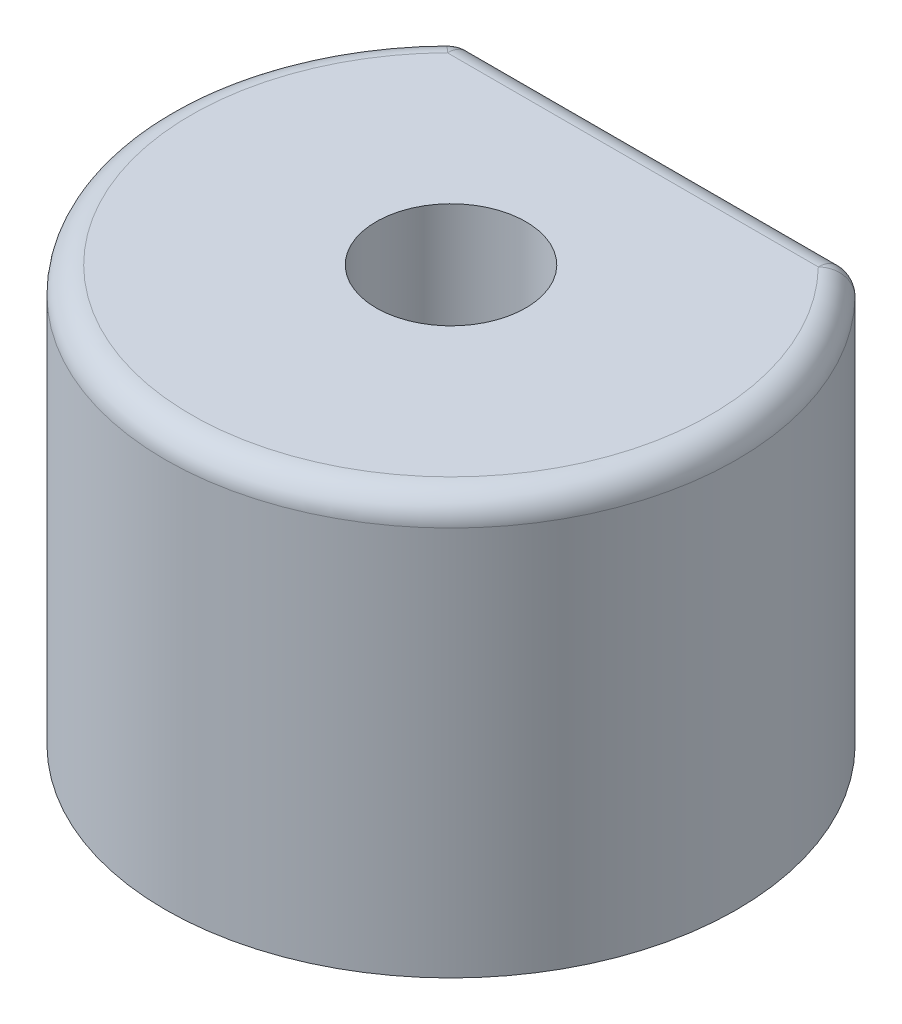
ISO-10303-21;
HEADER;
FILE_DESCRIPTION(('STEP AP214'),'2;1');
FILE_NAME('part.step','',(''),(''),'','','');
FILE_SCHEMA(('AUTOMOTIVE_DESIGN { 1 0 10303 214 1 1 1 1 }'));
ENDSEC;
DATA;
#1=APPLICATION_CONTEXT('core data for automotive mechanical design processes');
#2=APPLICATION_PROTOCOL_DEFINITION('international standard','automotive_design',2000,#1);
#3=PRODUCT_CONTEXT('',#1,'mechanical');
#4=PRODUCT('Part','Part','',(#3));
#5=PRODUCT_RELATED_PRODUCT_CATEGORY('part','',(#4));
#6=PRODUCT_DEFINITION_FORMATION('','',#4);
#7=PRODUCT_DEFINITION_CONTEXT('part definition',#1,'design');
#8=PRODUCT_DEFINITION('design','',#6,#7);
#9=PRODUCT_DEFINITION_SHAPE('','',#8);
#10=(LENGTH_UNIT() NAMED_UNIT(*) SI_UNIT(.MILLI.,.METRE.));
#11=(NAMED_UNIT(*) PLANE_ANGLE_UNIT() SI_UNIT($,.RADIAN.));
#12=(NAMED_UNIT(*) SI_UNIT($,.STERADIAN.) SOLID_ANGLE_UNIT());
#13=UNCERTAINTY_MEASURE_WITH_UNIT(LENGTH_MEASURE(1.E-05),#10,'distance_accuracy_value','');
#14=(GEOMETRIC_REPRESENTATION_CONTEXT(3) GLOBAL_UNCERTAINTY_ASSIGNED_CONTEXT((#13)) GLOBAL_UNIT_ASSIGNED_CONTEXT((#10,
#11,#12)) REPRESENTATION_CONTEXT('',''));
#15=CARTESIAN_POINT('',(0.,0.,0.));
#16=DIRECTION('',(0.,0.,1.));
#17=DIRECTION('',(1.,0.,0.));
#18=AXIS2_PLACEMENT_3D('',#15,#16,#17);
#19=CARTESIAN_POINT('',(0.,12.7,0.));
#20=DIRECTION('',(0.,1.,0.));
#21=DIRECTION('',(0.,0.,1.));
#22=AXIS2_PLACEMENT_3D('',#19,#20,#21);
#23=PLANE('',#22);
#24=CARTESIAN_POINT('',(0.,12.7,0.));
#25=DIRECTION('',(0.,1.,0.));
#26=DIRECTION('',(0.,0.,1.));
#27=AXIS2_PLACEMENT_3D('',#24,#25,#26);
#28=CIRCLE('',#27,7.9375);
#29=CARTESIAN_POINT('',(-5.66850881515612,12.7,-5.55624999999976));
#30=VERTEX_POINT('',#29);
#31=CARTESIAN_POINT('',(5.66850881515612,12.7,-5.55624999999976));
#32=VERTEX_POINT('',#31);
#33=EDGE_CURVE('E108',#30,#32,#28,.T.);
#34=ORIENTED_EDGE('',*,*,#33,.T.);
#35=DIRECTION('',(-1.,0.,0.));
#36=VECTOR('',#35,1.);
#37=CARTESIAN_POINT('',(-5.99268108299616,12.7,-5.55625));
#38=LINE('',#37,#36);
#39=EDGE_CURVE('E91',#32,#30,#38,.T.);
#40=ORIENTED_EDGE('',*,*,#39,.T.);
#41=EDGE_LOOP('',(#34,#40));
#42=FACE_BOUND('',#41,.T.);
#43=CARTESIAN_POINT('',(0.,12.7,0.));
#44=DIRECTION('',(0.,1.,0.));
#45=DIRECTION('',(0.,0.,1.));
#46=AXIS2_PLACEMENT_3D('',#43,#44,#45);
#47=CIRCLE('',#46,2.286);
#48=CARTESIAN_POINT('',(0.,12.7,2.286));
#49=VERTEX_POINT('',#48);
#50=EDGE_CURVE('E136',#49,#49,#47,.T.);
#51=ORIENTED_EDGE('',*,*,#50,.F.);
#52=EDGE_LOOP('',(#51));
#53=FACE_BOUND('',#52,.T.);
#54=ADVANCED_FACE('F39',(#42,#53),#23,.T.);
#55=CARTESIAN_POINT('',(0.,0.,0.));
#56=DIRECTION('',(0.,1.,0.));
#57=DIRECTION('',(0.,0.,1.));
#58=AXIS2_PLACEMENT_3D('',#55,#56,#57);
#59=PLANE('',#58);
#60=CARTESIAN_POINT('',(0.,0.,0.));
#61=DIRECTION('',(0.,1.,0.));
#62=DIRECTION('',(0.,0.,1.));
#63=AXIS2_PLACEMENT_3D('',#60,#61,#62);
#64=CIRCLE('',#63,8.73125);
#65=CARTESIAN_POINT('',(-6.23535969667148,0.,-6.111875));
#66=VERTEX_POINT('',#65);
#67=CARTESIAN_POINT('',(6.23535969667148,0.,-6.111875));
#68=VERTEX_POINT('',#67);
#69=EDGE_CURVE('E141',#66,#68,#64,.T.);
#70=ORIENTED_EDGE('',*,*,#69,.F.);
#71=CARTESIAN_POINT('',(-5.66850881515589,0.,-5.55625));
#72=DIRECTION('',(0.,1.,0.));
#73=DIRECTION('',(0.,0.,1.));
#74=AXIS2_PLACEMENT_3D('',#71,#72,#73);
#75=CIRCLE('',#74,0.79375);
#76=CARTESIAN_POINT('',(-5.66850881515589,0.,-6.35));
#77=VERTEX_POINT('',#76);
#78=EDGE_CURVE('E11',#66,#77,#75,.F.);
#79=ORIENTED_EDGE('',*,*,#78,.T.);
#80=DIRECTION('',(-1.,0.,0.));
#81=VECTOR('',#80,1.);
#82=CARTESIAN_POINT('',(5.99268108299616,0.,-6.35));
#83=LINE('',#82,#81);
#84=CARTESIAN_POINT('',(5.66850881515589,0.,-6.35));
#85=VERTEX_POINT('',#84);
#86=EDGE_CURVE('E113',#85,#77,#83,.T.);
#87=ORIENTED_EDGE('',*,*,#86,.F.);
#88=CARTESIAN_POINT('',(5.66850881515589,0.,-5.55625));
#89=DIRECTION('',(0.,1.,0.));
#90=DIRECTION('',(0.,0.,1.));
#91=AXIS2_PLACEMENT_3D('',#88,#89,#90);
#92=CIRCLE('',#91,0.79375);
#93=EDGE_CURVE('E48',#85,#68,#92,.F.);
#94=ORIENTED_EDGE('',*,*,#93,.T.);
#95=EDGE_LOOP('',(#70,#79,#87,#94));
#96=FACE_BOUND('',#95,.T.);
#97=CARTESIAN_POINT('',(0.,0.,0.));
#98=DIRECTION('',(0.,1.,0.));
#99=DIRECTION('',(0.,0.,1.));
#100=AXIS2_PLACEMENT_3D('',#97,#98,#99);
#101=CIRCLE('',#100,2.286);
#102=CARTESIAN_POINT('',(0.,0.,2.286));
#103=VERTEX_POINT('',#102);
#104=EDGE_CURVE('E132',#103,#103,#101,.T.);
#105=ORIENTED_EDGE('',*,*,#104,.T.);
#106=EDGE_LOOP('',(#105));
#107=FACE_BOUND('',#106,.T.);
#108=ADVANCED_FACE('F156',(#96,#107),#59,.F.);
#109=CARTESIAN_POINT('',(0.,12.7,0.));
#110=DIRECTION('',(0.,-1.,0.));
#111=DIRECTION('',(0.,0.,-1.));
#112=AXIS2_PLACEMENT_3D('',#109,#110,#111);
#113=CYLINDRICAL_SURFACE('',#112,8.73125);
#114=CARTESIAN_POINT('',(0.,11.90625,0.));
#115=DIRECTION('',(0.,1.,0.));
#116=DIRECTION('',(0.,0.,1.));
#117=AXIS2_PLACEMENT_3D('',#114,#115,#116);
#118=CIRCLE('',#117,8.73125);
#119=CARTESIAN_POINT('',(6.23535969667148,11.90625,-6.111875));
#120=VERTEX_POINT('',#119);
#121=CARTESIAN_POINT('',(-6.23535969667148,11.90625,-6.111875));
#122=VERTEX_POINT('',#121);
#123=EDGE_CURVE('E56',#120,#122,#118,.F.);
#124=ORIENTED_EDGE('',*,*,#123,.T.);
#125=DIRECTION('',(0.,-1.,0.));
#126=VECTOR('',#125,1.);
#127=CARTESIAN_POINT('',(-6.23535969667148,12.7,-6.111875));
#128=LINE('',#127,#126);
#129=EDGE_CURVE('E126',#122,#66,#128,.T.);
#130=ORIENTED_EDGE('',*,*,#129,.T.);
#131=ORIENTED_EDGE('',*,*,#69,.T.);
#132=DIRECTION('',(0.,-1.,0.));
#133=VECTOR('',#132,1.);
#134=CARTESIAN_POINT('',(6.23535969667148,12.7,-6.111875));
#135=LINE('',#134,#133);
#136=EDGE_CURVE('E61',#68,#120,#135,.F.);
#137=ORIENTED_EDGE('',*,*,#136,.T.);
#138=EDGE_LOOP('',(#124,#130,#131,#137));
#139=FACE_BOUND('',#138,.T.);
#140=ADVANCED_FACE('F155',(#139),#113,.T.);
#141=CARTESIAN_POINT('',(5.99268108299616,12.7,-6.35));
#142=DIRECTION('',(0.,0.,1.));
#143=DIRECTION('',(1.,0.,0.));
#144=AXIS2_PLACEMENT_3D('',#141,#142,#143);
#145=PLANE('',#144);
#146=ORIENTED_EDGE('',*,*,#86,.T.);
#147=DIRECTION('',(0.,-1.,0.));
#148=VECTOR('',#147,1.);
#149=CARTESIAN_POINT('',(-5.66850881515589,12.7,-6.35));
#150=LINE('',#149,#148);
#151=CARTESIAN_POINT('',(-5.66850881515589,11.90625,-6.35));
#152=VERTEX_POINT('',#151);
#153=EDGE_CURVE('E122',#77,#152,#150,.F.);
#154=ORIENTED_EDGE('',*,*,#153,.T.);
#155=DIRECTION('',(-1.,0.,0.));
#156=VECTOR('',#155,1.);
#157=CARTESIAN_POINT('',(5.99268108299616,11.90625,-6.35));
#158=LINE('',#157,#156);
#159=CARTESIAN_POINT('',(5.66850881515589,11.90625,-6.35));
#160=VERTEX_POINT('',#159);
#161=EDGE_CURVE('E93',#152,#160,#158,.F.);
#162=ORIENTED_EDGE('',*,*,#161,.T.);
#163=DIRECTION('',(0.,-1.,0.));
#164=VECTOR('',#163,1.);
#165=CARTESIAN_POINT('',(5.66850881515589,12.7,-6.35));
#166=LINE('',#165,#164);
#167=EDGE_CURVE('E116',#160,#85,#166,.T.);
#168=ORIENTED_EDGE('',*,*,#167,.T.);
#169=EDGE_LOOP('',(#146,#154,#162,#168));
#170=FACE_BOUND('',#169,.T.);
#171=ADVANCED_FACE('F148',(#170),#145,.F.);
#172=CARTESIAN_POINT('',(0.,12.7,0.));
#173=DIRECTION('',(0.,-1.,0.));
#174=DIRECTION('',(0.,0.,-1.));
#175=AXIS2_PLACEMENT_3D('',#172,#173,#174);
#176=CYLINDRICAL_SURFACE('',#175,2.286);
#177=ORIENTED_EDGE('',*,*,#50,.T.);
#178=EDGE_LOOP('',(#177));
#179=FACE_BOUND('',#178,.T.);
#180=ORIENTED_EDGE('',*,*,#104,.F.);
#181=EDGE_LOOP('',(#180));
#182=FACE_BOUND('',#181,.T.);
#183=ADVANCED_FACE('F159',(#179,#182),#176,.F.);
#184=CARTESIAN_POINT('',(5.66850881515589,12.7,-5.55625));
#185=DIRECTION('',(0.,-1.,0.));
#186=DIRECTION('',(0.,0.,-1.));
#187=AXIS2_PLACEMENT_3D('',#184,#185,#186);
#188=CYLINDRICAL_SURFACE('',#187,0.79375);
#189=ORIENTED_EDGE('',*,*,#93,.F.);
#190=ORIENTED_EDGE('',*,*,#167,.F.);
#191=CARTESIAN_POINT('',(5.66850881515589,11.90625,-5.55625));
#192=DIRECTION('',(0.,1.,0.));
#193=DIRECTION('',(0.,0.,1.));
#194=AXIS2_PLACEMENT_3D('',#191,#192,#193);
#195=CIRCLE('',#194,0.79375);
#196=EDGE_CURVE('E43',#120,#160,#195,.T.);
#197=ORIENTED_EDGE('',*,*,#196,.F.);
#198=ORIENTED_EDGE('',*,*,#136,.F.);
#199=EDGE_LOOP('',(#189,#190,#197,#198));
#200=FACE_BOUND('',#199,.T.);
#201=ADVANCED_FACE('F41',(#200),#188,.T.);
#202=CARTESIAN_POINT('',(0.,11.90625,0.));
#203=DIRECTION('',(0.,1.,0.));
#204=DIRECTION('',(0.,0.,1.));
#205=AXIS2_PLACEMENT_3D('',#202,#203,#204);
#206=TOROIDAL_SURFACE('',#205,7.9375,0.79375);
#207=CARTESIAN_POINT('',(-5.66850881515589,11.90625,-5.55625));
#208=DIRECTION('',(0.7,4.18804313297369E-13,-0.714142842854285));
#209=DIRECTION('',(-0.714142842854285,0.,-0.7));
#210=AXIS2_PLACEMENT_3D('',#207,#208,#209);
#211=CIRCLE('',#210,0.79375);
#212=EDGE_CURVE('E99',#122,#30,#211,.T.);
#213=ORIENTED_EDGE('',*,*,#212,.F.);
#214=ORIENTED_EDGE('',*,*,#123,.F.);
#215=CARTESIAN_POINT('',(5.66850881515612,11.90625,-5.55624999999976));
#216=DIRECTION('',(-0.700000000000299,0.,-0.714142842853992));
#217=DIRECTION('',(-0.714142842853992,0.,0.700000000000299));
#218=AXIS2_PLACEMENT_3D('',#215,#216,#217);
#219=CIRCLE('',#218,0.79375);
#220=EDGE_CURVE('E105',#32,#120,#219,.T.);
#221=ORIENTED_EDGE('',*,*,#220,.F.);
#222=ORIENTED_EDGE('',*,*,#33,.F.);
#223=EDGE_LOOP('',(#213,#214,#221,#222));
#224=FACE_BOUND('',#223,.T.);
#225=ADVANCED_FACE('F109',(#224),#206,.T.);
#226=CARTESIAN_POINT('',(-5.66850881515589,12.7,-5.55625));
#227=DIRECTION('',(0.,-1.,0.));
#228=DIRECTION('',(0.,0.,-1.));
#229=AXIS2_PLACEMENT_3D('',#226,#227,#228);
#230=CYLINDRICAL_SURFACE('',#229,0.79375);
#231=ORIENTED_EDGE('',*,*,#78,.F.);
#232=ORIENTED_EDGE('',*,*,#129,.F.);
#233=CARTESIAN_POINT('',(-5.66850881515589,11.90625,-5.55625));
#234=DIRECTION('',(0.,1.,0.));
#235=DIRECTION('',(0.,0.,1.));
#236=AXIS2_PLACEMENT_3D('',#233,#234,#235);
#237=CIRCLE('',#236,0.79375);
#238=EDGE_CURVE('E103',#152,#122,#237,.T.);
#239=ORIENTED_EDGE('',*,*,#238,.F.);
#240=ORIENTED_EDGE('',*,*,#153,.F.);
#241=EDGE_LOOP('',(#231,#232,#239,#240));
#242=FACE_BOUND('',#241,.T.);
#243=ADVANCED_FACE('F153',(#242),#230,.T.);
#244=CARTESIAN_POINT('',(5.66850881515589,11.90625,-5.55625));
#245=DIRECTION('',(4.46930331763474E-13,1.,1.48612530855336E-13));
#246=DIRECTION('',(-1.,4.46930331763474E-13,0.));
#247=AXIS2_PLACEMENT_3D('',#244,#245,#246);
#248=SPHERICAL_SURFACE('',#247,0.79375);
#249=ORIENTED_EDGE('',*,*,#220,.T.);
#250=ORIENTED_EDGE('',*,*,#196,.T.);
#251=CARTESIAN_POINT('',(5.66850881515589,11.90625,-5.55625));
#252=DIRECTION('',(1.,-5.98821080211207E-13,0.));
#253=DIRECTION('',(5.98821080211207E-13,1.,0.));
#254=AXIS2_PLACEMENT_3D('',#251,#252,#253);
#255=CIRCLE('',#254,0.79375);
#256=EDGE_CURVE('E96',#32,#160,#255,.F.);
#257=ORIENTED_EDGE('',*,*,#256,.F.);
#258=EDGE_LOOP('',(#249,#250,#257));
#259=FACE_BOUND('',#258,.T.);
#260=ADVANCED_FACE('F181',(#259),#248,.T.);
#261=CARTESIAN_POINT('',(-5.66850881515589,11.90625,-5.55625));
#262=DIRECTION('',(-4.46930331763474E-13,1.,1.48612530855336E-13));
#263=DIRECTION('',(-1.,-4.46930331763474E-13,0.));
#264=AXIS2_PLACEMENT_3D('',#261,#262,#263);
#265=SPHERICAL_SURFACE('',#264,0.79375);
#266=ORIENTED_EDGE('',*,*,#238,.T.);
#267=ORIENTED_EDGE('',*,*,#212,.T.);
#268=CARTESIAN_POINT('',(-5.66850881515636,11.90625,-5.55625));
#269=DIRECTION('',(-1.,0.,-5.98821080211206E-13));
#270=DIRECTION('',(-5.98821080211206E-13,0.,1.));
#271=AXIS2_PLACEMENT_3D('',#268,#269,#270);
#272=CIRCLE('',#271,0.79375);
#273=EDGE_CURVE('E87',#152,#30,#272,.F.);
#274=ORIENTED_EDGE('',*,*,#273,.F.);
#275=EDGE_LOOP('',(#266,#267,#274));
#276=FACE_BOUND('',#275,.T.);
#277=ADVANCED_FACE('F101',(#276),#265,.T.);
#278=CARTESIAN_POINT('',(0.,11.90625,-5.55625));
#279=DIRECTION('',(1.,0.,0.));
#280=DIRECTION('',(0.,0.,-1.));
#281=AXIS2_PLACEMENT_3D('',#278,#279,#280);
#282=CYLINDRICAL_SURFACE('',#281,0.79375);
#283=ORIENTED_EDGE('',*,*,#256,.T.);
#284=ORIENTED_EDGE('',*,*,#161,.F.);
#285=ORIENTED_EDGE('',*,*,#273,.T.);
#286=ORIENTED_EDGE('',*,*,#39,.F.);
#287=EDGE_LOOP('',(#283,#284,#285,#286));
#288=FACE_BOUND('',#287,.T.);
#289=ADVANCED_FACE('F89',(#288),#282,.T.);
#290=CLOSED_SHELL('',(#54,#108,#140,#171,#183,#201,#225,#243,#260,#277,#289));
#291=MANIFOLD_SOLID_BREP('B2',#290);
#292=ADVANCED_BREP_SHAPE_REPRESENTATION('',(#18,#291),#14);
#293=SHAPE_DEFINITION_REPRESENTATION(#9,#292);
ENDSEC;
END-ISO-10303-21;
